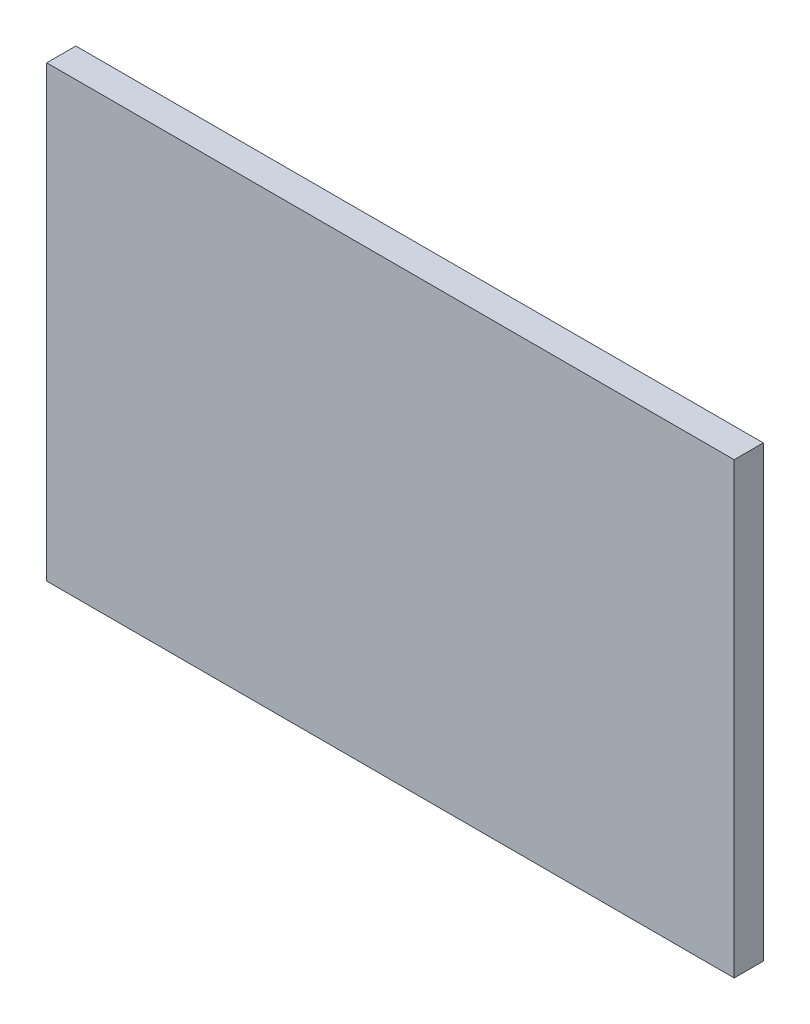
ISO-10303-21;
HEADER;
FILE_DESCRIPTION(('STEP AP214'),'2;1');
FILE_NAME('part.step','',(''),(''),'','','');
FILE_SCHEMA(('AUTOMOTIVE_DESIGN { 1 0 10303 214 1 1 1 1 }'));
ENDSEC;
DATA;
#1=APPLICATION_CONTEXT('core data for automotive mechanical design processes');
#2=APPLICATION_PROTOCOL_DEFINITION('international standard','automotive_design',2000,#1);
#3=PRODUCT_CONTEXT('',#1,'mechanical');
#4=PRODUCT('Part','Part','',(#3));
#5=PRODUCT_RELATED_PRODUCT_CATEGORY('part','',(#4));
#6=PRODUCT_DEFINITION_FORMATION('','',#4);
#7=PRODUCT_DEFINITION_CONTEXT('part definition',#1,'design');
#8=PRODUCT_DEFINITION('design','',#6,#7);
#9=PRODUCT_DEFINITION_SHAPE('','',#8);
#10=(LENGTH_UNIT() NAMED_UNIT(*) SI_UNIT(.MILLI.,.METRE.));
#11=(NAMED_UNIT(*) PLANE_ANGLE_UNIT() SI_UNIT($,.RADIAN.));
#12=(NAMED_UNIT(*) SI_UNIT($,.STERADIAN.) SOLID_ANGLE_UNIT());
#13=UNCERTAINTY_MEASURE_WITH_UNIT(LENGTH_MEASURE(1.E-05),#10,'distance_accuracy_value','');
#14=(GEOMETRIC_REPRESENTATION_CONTEXT(3) GLOBAL_UNCERTAINTY_ASSIGNED_CONTEXT((#13)) GLOBAL_UNIT_ASSIGNED_CONTEXT((#10,
#11,#12)) REPRESENTATION_CONTEXT('',''));
#15=CARTESIAN_POINT('',(0.,0.,0.));
#16=DIRECTION('',(0.,0.,1.));
#17=DIRECTION('',(1.,0.,0.));
#18=AXIS2_PLACEMENT_3D('',#15,#16,#17);
#19=CARTESIAN_POINT('',(53.4975044976209,2.8086131224409,3.6));
#20=DIRECTION('',(1.,0.,0.));
#21=DIRECTION('',(0.,0.,-1.));
#22=AXIS2_PLACEMENT_3D('',#19,#20,#21);
#23=PLANE('',#22);
#24=DIRECTION('',(0.,-1.,0.));
#25=VECTOR('',#24,1.);
#26=CARTESIAN_POINT('',(53.4975044976209,2.8086131224409,0.));
#27=LINE('',#26,#25);
#28=CARTESIAN_POINT('',(53.4975044976209,58.3086131224409,0.));
#29=VERTEX_POINT('',#28);
#30=CARTESIAN_POINT('',(53.4975044976209,2.8086131224409,0.));
#31=VERTEX_POINT('',#30);
#32=EDGE_CURVE('E99',#29,#31,#27,.T.);
#33=ORIENTED_EDGE('',*,*,#32,.T.);
#34=DIRECTION('',(0.,0.,-1.));
#35=VECTOR('',#34,1.);
#36=CARTESIAN_POINT('',(53.4975044976209,2.8086131224409,3.6));
#37=LINE('',#36,#35);
#38=CARTESIAN_POINT('',(53.4975044976209,2.8086131224409,3.6));
#39=VERTEX_POINT('',#38);
#40=EDGE_CURVE('E11',#39,#31,#37,.T.);
#41=ORIENTED_EDGE('',*,*,#40,.F.);
#42=DIRECTION('',(0.,-1.,0.));
#43=VECTOR('',#42,1.);
#44=CARTESIAN_POINT('',(53.4975044976209,2.8086131224409,3.6));
#45=LINE('',#44,#43);
#46=CARTESIAN_POINT('',(53.4975044976209,58.3086131224409,3.6));
#47=VERTEX_POINT('',#46);
#48=EDGE_CURVE('E87',#47,#39,#45,.T.);
#49=ORIENTED_EDGE('',*,*,#48,.F.);
#50=DIRECTION('',(0.,0.,-1.));
#51=VECTOR('',#50,1.);
#52=CARTESIAN_POINT('',(53.4975044976209,58.3086131224409,3.6));
#53=LINE('',#52,#51);
#54=EDGE_CURVE('E95',#47,#29,#53,.T.);
#55=ORIENTED_EDGE('',*,*,#54,.T.);
#56=EDGE_LOOP('',(#33,#41,#49,#55));
#57=FACE_BOUND('',#56,.T.);
#58=ADVANCED_FACE('F36',(#57),#23,.F.);
#59=CARTESIAN_POINT('',(53.4975044976209,2.8086131224409,3.6));
#60=DIRECTION('',(0.,1.,0.));
#61=DIRECTION('',(0.,0.,1.));
#62=AXIS2_PLACEMENT_3D('',#59,#60,#61);
#63=PLANE('',#62);
#64=DIRECTION('',(1.,0.,0.));
#65=VECTOR('',#64,1.);
#66=CARTESIAN_POINT('',(53.4975044976209,2.8086131224409,0.));
#67=LINE('',#66,#65);
#68=CARTESIAN_POINT('',(138.497504497621,2.8086131224409,0.));
#69=VERTEX_POINT('',#68);
#70=EDGE_CURVE('E91',#31,#69,#67,.T.);
#71=ORIENTED_EDGE('',*,*,#70,.T.);
#72=DIRECTION('',(0.,0.,-1.));
#73=VECTOR('',#72,1.);
#74=CARTESIAN_POINT('',(138.497504497621,2.8086131224409,3.6));
#75=LINE('',#74,#73);
#76=CARTESIAN_POINT('',(138.497504497621,2.8086131224409,3.6));
#77=VERTEX_POINT('',#76);
#78=EDGE_CURVE('E44',#77,#69,#75,.T.);
#79=ORIENTED_EDGE('',*,*,#78,.F.);
#80=DIRECTION('',(1.,0.,0.));
#81=VECTOR('',#80,1.);
#82=CARTESIAN_POINT('',(53.4975044976209,2.8086131224409,3.6));
#83=LINE('',#82,#81);
#84=EDGE_CURVE('E82',#39,#77,#83,.T.);
#85=ORIENTED_EDGE('',*,*,#84,.F.);
#86=ORIENTED_EDGE('',*,*,#40,.T.);
#87=EDGE_LOOP('',(#71,#79,#85,#86));
#88=FACE_BOUND('',#87,.T.);
#89=ADVANCED_FACE('F90',(#88),#63,.F.);
#90=CARTESIAN_POINT('',(138.497504497621,2.8086131224409,3.6));
#91=DIRECTION('',(-1.,0.,0.));
#92=DIRECTION('',(0.,0.,1.));
#93=AXIS2_PLACEMENT_3D('',#90,#91,#92);
#94=PLANE('',#93);
#95=DIRECTION('',(0.,1.,0.));
#96=VECTOR('',#95,1.);
#97=CARTESIAN_POINT('',(138.497504497621,2.8086131224409,0.));
#98=LINE('',#97,#96);
#99=CARTESIAN_POINT('',(138.497504497621,58.3086131224409,0.));
#100=VERTEX_POINT('',#99);
#101=EDGE_CURVE('E69',#69,#100,#98,.T.);
#102=ORIENTED_EDGE('',*,*,#101,.T.);
#103=DIRECTION('',(0.,0.,-1.));
#104=VECTOR('',#103,1.);
#105=CARTESIAN_POINT('',(138.497504497621,58.3086131224409,3.6));
#106=LINE('',#105,#104);
#107=CARTESIAN_POINT('',(138.497504497621,58.3086131224409,3.6));
#108=VERTEX_POINT('',#107);
#109=EDGE_CURVE('E92',#108,#100,#106,.T.);
#110=ORIENTED_EDGE('',*,*,#109,.F.);
#111=DIRECTION('',(0.,1.,0.));
#112=VECTOR('',#111,1.);
#113=CARTESIAN_POINT('',(138.497504497621,2.8086131224409,3.6));
#114=LINE('',#113,#112);
#115=EDGE_CURVE('E85',#77,#108,#114,.T.);
#116=ORIENTED_EDGE('',*,*,#115,.F.);
#117=ORIENTED_EDGE('',*,*,#78,.T.);
#118=EDGE_LOOP('',(#102,#110,#116,#117));
#119=FACE_BOUND('',#118,.T.);
#120=ADVANCED_FACE('F93',(#119),#94,.F.);
#121=CARTESIAN_POINT('',(53.4975044976209,58.3086131224409,3.6));
#122=DIRECTION('',(0.,-1.,0.));
#123=DIRECTION('',(0.,0.,-1.));
#124=AXIS2_PLACEMENT_3D('',#121,#122,#123);
#125=PLANE('',#124);
#126=DIRECTION('',(-1.,0.,0.));
#127=VECTOR('',#126,1.);
#128=CARTESIAN_POINT('',(53.4975044976209,58.3086131224409,0.));
#129=LINE('',#128,#127);
#130=EDGE_CURVE('E75',#100,#29,#129,.T.);
#131=ORIENTED_EDGE('',*,*,#130,.T.);
#132=ORIENTED_EDGE('',*,*,#54,.F.);
#133=DIRECTION('',(-1.,0.,0.));
#134=VECTOR('',#133,1.);
#135=CARTESIAN_POINT('',(53.4975044976209,58.3086131224409,3.6));
#136=LINE('',#135,#134);
#137=EDGE_CURVE('E52',#108,#47,#136,.T.);
#138=ORIENTED_EDGE('',*,*,#137,.F.);
#139=ORIENTED_EDGE('',*,*,#109,.T.);
#140=EDGE_LOOP('',(#131,#132,#138,#139));
#141=FACE_BOUND('',#140,.T.);
#142=ADVANCED_FACE('F106',(#141),#125,.F.);
#143=CARTESIAN_POINT('',(0.,0.,3.6));
#144=DIRECTION('',(0.,0.,-1.));
#145=DIRECTION('',(-1.,0.,0.));
#146=AXIS2_PLACEMENT_3D('',#143,#144,#145);
#147=PLANE('',#146);
#148=ORIENTED_EDGE('',*,*,#48,.T.);
#149=ORIENTED_EDGE('',*,*,#84,.T.);
#150=ORIENTED_EDGE('',*,*,#115,.T.);
#151=ORIENTED_EDGE('',*,*,#137,.T.);
#152=EDGE_LOOP('',(#148,#149,#150,#151));
#153=FACE_BOUND('',#152,.T.);
#154=ADVANCED_FACE('F83',(#153),#147,.F.);
#155=CARTESIAN_POINT('',(0.,0.,0.));
#156=DIRECTION('',(0.,0.,-1.));
#157=DIRECTION('',(-1.,0.,0.));
#158=AXIS2_PLACEMENT_3D('',#155,#156,#157);
#159=PLANE('',#158);
#160=ORIENTED_EDGE('',*,*,#32,.F.);
#161=ORIENTED_EDGE('',*,*,#130,.F.);
#162=ORIENTED_EDGE('',*,*,#101,.F.);
#163=ORIENTED_EDGE('',*,*,#70,.F.);
#164=EDGE_LOOP('',(#160,#161,#162,#163));
#165=FACE_BOUND('',#164,.T.);
#166=ADVANCED_FACE('F109',(#165),#159,.T.);
#167=CLOSED_SHELL('',(#58,#89,#120,#142,#154,#166));
#168=MANIFOLD_SOLID_BREP('B2',#167);
#169=ADVANCED_BREP_SHAPE_REPRESENTATION('',(#18,#168),#14);
#170=SHAPE_DEFINITION_REPRESENTATION(#9,#169);
ENDSEC;
END-ISO-10303-21;
